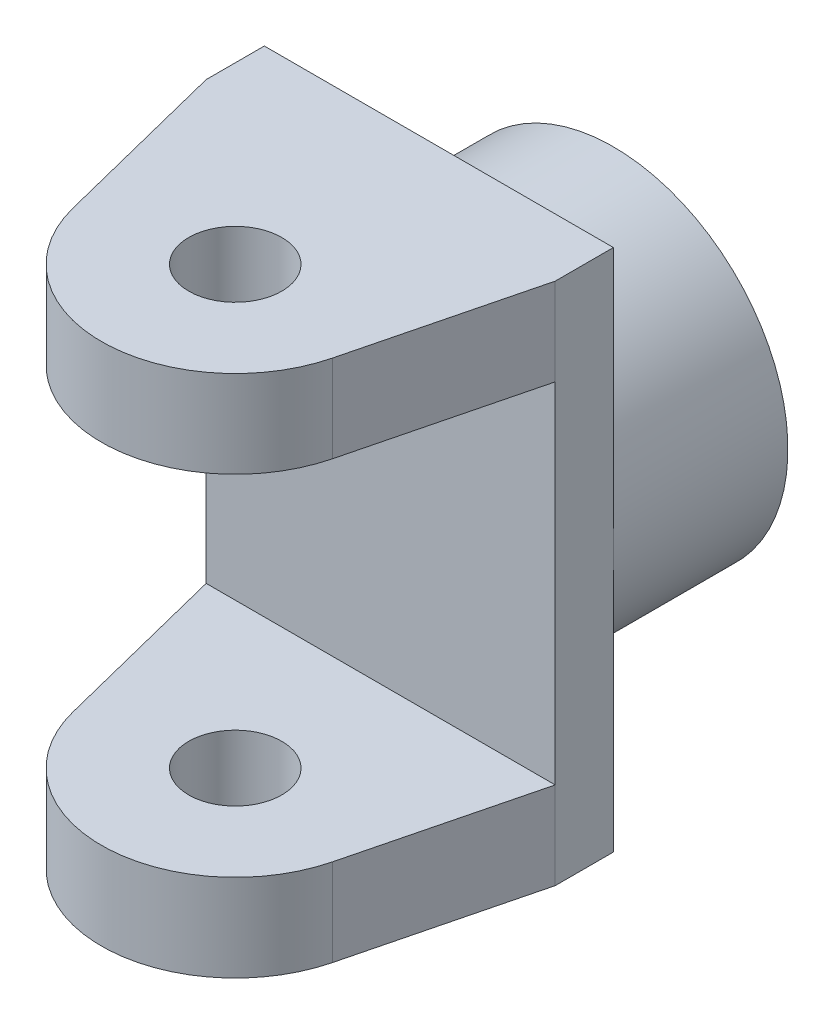
ISO-10303-21;
HEADER;
FILE_DESCRIPTION(('STEP AP214'),'2;1');
FILE_NAME('part.step','',(''),(''),'','','');
FILE_SCHEMA(('AUTOMOTIVE_DESIGN { 1 0 10303 214 1 1 1 1 }'));
ENDSEC;
DATA;
#1=APPLICATION_CONTEXT('core data for automotive mechanical design processes');
#2=APPLICATION_PROTOCOL_DEFINITION('international standard','automotive_design',2000,#1);
#3=PRODUCT_CONTEXT('',#1,'mechanical');
#4=PRODUCT('Part','Part','',(#3));
#5=PRODUCT_RELATED_PRODUCT_CATEGORY('part','',(#4));
#6=PRODUCT_DEFINITION_FORMATION('','',#4);
#7=PRODUCT_DEFINITION_CONTEXT('part definition',#1,'design');
#8=PRODUCT_DEFINITION('design','',#6,#7);
#9=PRODUCT_DEFINITION_SHAPE('','',#8);
#10=(LENGTH_UNIT() NAMED_UNIT(*) SI_UNIT(.MILLI.,.METRE.));
#11=(NAMED_UNIT(*) PLANE_ANGLE_UNIT() SI_UNIT($,.RADIAN.));
#12=(NAMED_UNIT(*) SI_UNIT($,.STERADIAN.) SOLID_ANGLE_UNIT());
#13=UNCERTAINTY_MEASURE_WITH_UNIT(LENGTH_MEASURE(1.E-05),#10,'distance_accuracy_value','');
#14=(GEOMETRIC_REPRESENTATION_CONTEXT(3) GLOBAL_UNCERTAINTY_ASSIGNED_CONTEXT((#13)) GLOBAL_UNIT_ASSIGNED_CONTEXT((#10,
#11,#12)) REPRESENTATION_CONTEXT('',''));
#15=CARTESIAN_POINT('',(0.,0.,0.));
#16=DIRECTION('',(0.,0.,1.));
#17=DIRECTION('',(1.,0.,0.));
#18=AXIS2_PLACEMENT_3D('',#15,#16,#17);
#19=CARTESIAN_POINT('',(0.,0.,10.));
#20=DIRECTION('',(0.,0.,-1.));
#21=DIRECTION('',(-1.,0.,0.));
#22=AXIS2_PLACEMENT_3D('',#19,#20,#21);
#23=PLANE('',#22);
#24=DIRECTION('',(-1.,0.,0.));
#25=VECTOR('',#24,1.);
#26=CARTESIAN_POINT('',(30.,-30.,10.));
#27=LINE('',#26,#25);
#28=CARTESIAN_POINT('',(30.,-30.,10.));
#29=VERTEX_POINT('',#28);
#30=CARTESIAN_POINT('',(-30.,-30.,10.));
#31=VERTEX_POINT('',#30);
#32=EDGE_CURVE('E64',#29,#31,#27,.T.);
#33=ORIENTED_EDGE('',*,*,#32,.F.);
#34=DIRECTION('',(0.,1.,0.));
#35=VECTOR('',#34,1.);
#36=CARTESIAN_POINT('',(30.,-45.,10.));
#37=LINE('',#36,#35);
#38=CARTESIAN_POINT('',(30.,30.,10.));
#39=VERTEX_POINT('',#38);
#40=EDGE_CURVE('E299',#29,#39,#37,.T.);
#41=ORIENTED_EDGE('',*,*,#40,.T.);
#42=DIRECTION('',(-1.,0.,0.));
#43=VECTOR('',#42,1.);
#44=CARTESIAN_POINT('',(30.,30.,10.));
#45=LINE('',#44,#43);
#46=CARTESIAN_POINT('',(-30.,30.,10.));
#47=VERTEX_POINT('',#46);
#48=EDGE_CURVE('E214',#39,#47,#45,.T.);
#49=ORIENTED_EDGE('',*,*,#48,.T.);
#50=DIRECTION('',(0.,-1.,0.));
#51=VECTOR('',#50,1.);
#52=CARTESIAN_POINT('',(-30.,-45.,10.));
#53=LINE('',#52,#51);
#54=EDGE_CURVE('E298',#47,#31,#53,.T.);
#55=ORIENTED_EDGE('',*,*,#54,.T.);
#56=EDGE_LOOP('',(#33,#41,#49,#55));
#57=FACE_BOUND('',#56,.T.);
#58=ADVANCED_FACE('F39',(#57),#23,.F.);
#59=CARTESIAN_POINT('',(0.,0.,0.));
#60=DIRECTION('',(0.,0.,-1.));
#61=DIRECTION('',(-1.,0.,0.));
#62=AXIS2_PLACEMENT_3D('',#59,#60,#61);
#63=PLANE('',#62);
#64=CARTESIAN_POINT('',(0.,0.,0.));
#65=DIRECTION('',(0.,0.,-1.));
#66=DIRECTION('',(-1.,0.,0.));
#67=AXIS2_PLACEMENT_3D('',#64,#65,#66);
#68=CIRCLE('',#67,30.);
#69=CARTESIAN_POINT('',(-30.,0.,0.));
#70=VERTEX_POINT('',#69);
#71=CARTESIAN_POINT('',(30.,0.,0.));
#72=VERTEX_POINT('',#71);
#73=EDGE_CURVE('E50',#70,#72,#68,.T.);
#74=ORIENTED_EDGE('',*,*,#73,.F.);
#75=DIRECTION('',(0.,-1.,0.));
#76=VECTOR('',#75,1.);
#77=CARTESIAN_POINT('',(-30.,-45.,0.));
#78=LINE('',#77,#76);
#79=CARTESIAN_POINT('',(-30.,45.,0.));
#80=VERTEX_POINT('',#79);
#81=EDGE_CURVE('E313',#80,#70,#78,.T.);
#82=ORIENTED_EDGE('',*,*,#81,.F.);
#83=DIRECTION('',(-1.,0.,0.));
#84=VECTOR('',#83,1.);
#85=CARTESIAN_POINT('',(-30.,45.,0.));
#86=LINE('',#85,#84);
#87=CARTESIAN_POINT('',(30.,45.,0.));
#88=VERTEX_POINT('',#87);
#89=EDGE_CURVE('E309',#88,#80,#86,.T.);
#90=ORIENTED_EDGE('',*,*,#89,.F.);
#91=DIRECTION('',(0.,1.,0.));
#92=VECTOR('',#91,1.);
#93=CARTESIAN_POINT('',(30.,-45.,0.));
#94=LINE('',#93,#92);
#95=EDGE_CURVE('E292',#72,#88,#94,.T.);
#96=ORIENTED_EDGE('',*,*,#95,.F.);
#97=EDGE_LOOP('',(#74,#82,#90,#96));
#98=FACE_BOUND('',#97,.T.);
#99=ADVANCED_FACE('F346',(#98),#63,.T.);
#100=CARTESIAN_POINT('',(30.,-45.,10.));
#101=DIRECTION('',(-1.,0.,0.));
#102=DIRECTION('',(0.,0.,1.));
#103=AXIS2_PLACEMENT_3D('',#100,#101,#102);
#104=PLANE('',#103);
#105=CARTESIAN_POINT('',(30.,-45.,0.));
#106=VERTEX_POINT('',#105);
#107=EDGE_CURVE('E305',#106,#72,#94,.T.);
#108=ORIENTED_EDGE('',*,*,#107,.T.);
#109=ORIENTED_EDGE('',*,*,#95,.T.);
#110=DIRECTION('',(0.,0.,-1.));
#111=VECTOR('',#110,1.);
#112=CARTESIAN_POINT('',(30.,45.,10.));
#113=LINE('',#112,#111);
#114=CARTESIAN_POINT('',(30.,45.,10.));
#115=VERTEX_POINT('',#114);
#116=EDGE_CURVE('E43',#115,#88,#113,.T.);
#117=ORIENTED_EDGE('',*,*,#116,.F.);
#118=DIRECTION('',(0.,1.,0.));
#119=VECTOR('',#118,1.);
#120=CARTESIAN_POINT('',(30.,30.,10.));
#121=LINE('',#120,#119);
#122=EDGE_CURVE('E227',#39,#115,#121,.T.);
#123=ORIENTED_EDGE('',*,*,#122,.F.);
#124=ORIENTED_EDGE('',*,*,#40,.F.);
#125=CARTESIAN_POINT('',(30.,-45.,10.));
#126=VERTEX_POINT('',#125);
#127=EDGE_CURVE('E177',#126,#29,#37,.T.);
#128=ORIENTED_EDGE('',*,*,#127,.F.);
#129=DIRECTION('',(0.,0.,-1.));
#130=VECTOR('',#129,1.);
#131=CARTESIAN_POINT('',(30.,-45.,10.));
#132=LINE('',#131,#130);
#133=EDGE_CURVE('E304',#126,#106,#132,.T.);
#134=ORIENTED_EDGE('',*,*,#133,.T.);
#135=EDGE_LOOP('',(#108,#109,#117,#123,#124,#128,#134));
#136=FACE_BOUND('',#135,.T.);
#137=ADVANCED_FACE('F41',(#136),#104,.F.);
#138=CARTESIAN_POINT('',(-30.,45.,10.));
#139=DIRECTION('',(0.,-1.,0.));
#140=DIRECTION('',(0.,0.,-1.));
#141=AXIS2_PLACEMENT_3D('',#138,#139,#140);
#142=PLANE('',#141);
#143=ORIENTED_EDGE('',*,*,#89,.T.);
#144=DIRECTION('',(0.,0.,-1.));
#145=VECTOR('',#144,1.);
#146=CARTESIAN_POINT('',(-30.,45.,10.));
#147=LINE('',#146,#145);
#148=CARTESIAN_POINT('',(-30.,45.,10.));
#149=VERTEX_POINT('',#148);
#150=EDGE_CURVE('E325',#149,#80,#147,.T.);
#151=ORIENTED_EDGE('',*,*,#150,.F.);
#152=DIRECTION('',(0.243792806743351,0.,0.969827338952764));
#153=VECTOR('',#152,1.);
#154=CARTESIAN_POINT('',(-30.,45.,10.));
#155=LINE('',#154,#153);
#156=CARTESIAN_POINT('',(-22.3060287959128,45.,40.6072345550969));
#157=VERTEX_POINT('',#156);
#158=EDGE_CURVE('E231',#149,#157,#155,.T.);
#159=ORIENTED_EDGE('',*,*,#158,.T.);
#160=CARTESIAN_POINT('',(0.,45.,35.));
#161=DIRECTION('',(0.,1.,0.));
#162=DIRECTION('',(0.,0.,1.));
#163=AXIS2_PLACEMENT_3D('',#160,#161,#162);
#164=CIRCLE('',#163,22.9999999999992);
#165=CARTESIAN_POINT('',(22.3060287959128,45.,40.6072345550969));
#166=VERTEX_POINT('',#165);
#167=EDGE_CURVE('E215',#157,#166,#164,.T.);
#168=ORIENTED_EDGE('',*,*,#167,.T.);
#169=DIRECTION('',(0.24379280674335,0.,-0.969827338952764));
#170=VECTOR('',#169,1.);
#171=CARTESIAN_POINT('',(30.,45.,10.));
#172=LINE('',#171,#170);
#173=EDGE_CURVE('E206',#166,#115,#172,.T.);
#174=ORIENTED_EDGE('',*,*,#173,.T.);
#175=ORIENTED_EDGE('',*,*,#116,.T.);
#176=EDGE_LOOP('',(#143,#151,#159,#168,#174,#175));
#177=FACE_BOUND('',#176,.T.);
#178=CARTESIAN_POINT('',(0.,45.,35.));
#179=DIRECTION('',(0.,1.,0.));
#180=DIRECTION('',(0.,0.,1.));
#181=AXIS2_PLACEMENT_3D('',#178,#179,#180);
#182=CIRCLE('',#181,8.);
#183=CARTESIAN_POINT('',(0.,45.,43.));
#184=VERTEX_POINT('',#183);
#185=EDGE_CURVE('E199',#184,#184,#182,.T.);
#186=ORIENTED_EDGE('',*,*,#185,.F.);
#187=EDGE_LOOP('',(#186));
#188=FACE_BOUND('',#187,.T.);
#189=ADVANCED_FACE('F335',(#177,#188),#142,.F.);
#190=CARTESIAN_POINT('',(-30.,-45.,10.));
#191=DIRECTION('',(1.,0.,0.));
#192=DIRECTION('',(0.,0.,-1.));
#193=AXIS2_PLACEMENT_3D('',#190,#191,#192);
#194=PLANE('',#193);
#195=ORIENTED_EDGE('',*,*,#81,.T.);
#196=CARTESIAN_POINT('',(-30.,-45.,0.));
#197=VERTEX_POINT('',#196);
#198=EDGE_CURVE('E312',#70,#197,#78,.T.);
#199=ORIENTED_EDGE('',*,*,#198,.T.);
#200=DIRECTION('',(0.,0.,-1.));
#201=VECTOR('',#200,1.);
#202=CARTESIAN_POINT('',(-30.,-45.,10.));
#203=LINE('',#202,#201);
#204=CARTESIAN_POINT('',(-30.,-45.,10.));
#205=VERTEX_POINT('',#204);
#206=EDGE_CURVE('E322',#205,#197,#203,.T.);
#207=ORIENTED_EDGE('',*,*,#206,.F.);
#208=DIRECTION('',(0.,-1.,0.));
#209=VECTOR('',#208,1.);
#210=CARTESIAN_POINT('',(-30.,-30.,10.));
#211=LINE('',#210,#209);
#212=EDGE_CURVE('E57',#31,#205,#211,.T.);
#213=ORIENTED_EDGE('',*,*,#212,.F.);
#214=ORIENTED_EDGE('',*,*,#54,.F.);
#215=EDGE_CURVE('E300',#149,#47,#53,.T.);
#216=ORIENTED_EDGE('',*,*,#215,.F.);
#217=ORIENTED_EDGE('',*,*,#150,.T.);
#218=EDGE_LOOP('',(#195,#199,#207,#213,#214,#216,#217));
#219=FACE_BOUND('',#218,.T.);
#220=ADVANCED_FACE('F348',(#219),#194,.F.);
#221=CARTESIAN_POINT('',(-30.,-45.,10.));
#222=DIRECTION('',(0.,1.,0.));
#223=DIRECTION('',(0.,0.,1.));
#224=AXIS2_PLACEMENT_3D('',#221,#222,#223);
#225=PLANE('',#224);
#226=DIRECTION('',(1.,0.,0.));
#227=VECTOR('',#226,1.);
#228=CARTESIAN_POINT('',(-30.,-45.,0.));
#229=LINE('',#228,#227);
#230=EDGE_CURVE('E316',#197,#106,#229,.T.);
#231=ORIENTED_EDGE('',*,*,#230,.T.);
#232=ORIENTED_EDGE('',*,*,#133,.F.);
#233=DIRECTION('',(0.24379280674335,0.,-0.969827338952764));
#234=VECTOR('',#233,1.);
#235=CARTESIAN_POINT('',(30.,-45.,10.));
#236=LINE('',#235,#234);
#237=CARTESIAN_POINT('',(22.3060287959128,-45.,40.6072345550969));
#238=VERTEX_POINT('',#237);
#239=EDGE_CURVE('E191',#238,#126,#236,.T.);
#240=ORIENTED_EDGE('',*,*,#239,.F.);
#241=CARTESIAN_POINT('',(0.,-45.,35.));
#242=DIRECTION('',(0.,1.,0.));
#243=DIRECTION('',(0.,0.,1.));
#244=AXIS2_PLACEMENT_3D('',#241,#242,#243);
#245=CIRCLE('',#244,22.9999999999992);
#246=CARTESIAN_POINT('',(-22.3060287959128,-45.,40.6072345550969));
#247=VERTEX_POINT('',#246);
#248=EDGE_CURVE('E168',#247,#238,#245,.T.);
#249=ORIENTED_EDGE('',*,*,#248,.F.);
#250=DIRECTION('',(0.243792806743351,0.,0.969827338952764));
#251=VECTOR('',#250,1.);
#252=CARTESIAN_POINT('',(-30.,-45.,10.));
#253=LINE('',#252,#251);
#254=EDGE_CURVE('E179',#205,#247,#253,.T.);
#255=ORIENTED_EDGE('',*,*,#254,.F.);
#256=ORIENTED_EDGE('',*,*,#206,.T.);
#257=EDGE_LOOP('',(#231,#232,#240,#249,#255,#256));
#258=FACE_BOUND('',#257,.T.);
#259=CARTESIAN_POINT('',(0.,-45.,35.));
#260=DIRECTION('',(0.,1.,0.));
#261=DIRECTION('',(0.,0.,1.));
#262=AXIS2_PLACEMENT_3D('',#259,#260,#261);
#263=CIRCLE('',#262,8.);
#264=CARTESIAN_POINT('',(0.,-45.,43.));
#265=VERTEX_POINT('',#264);
#266=EDGE_CURVE('E184',#265,#265,#263,.T.);
#267=ORIENTED_EDGE('',*,*,#266,.T.);
#268=EDGE_LOOP('',(#267));
#269=FACE_BOUND('',#268,.T.);
#270=ADVANCED_FACE('F360',(#258,#269),#225,.F.);
#271=EDGE_CURVE('E11',#72,#70,#68,.T.);
#272=ORIENTED_EDGE('',*,*,#271,.F.);
#273=ORIENTED_EDGE('',*,*,#107,.F.);
#274=ORIENTED_EDGE('',*,*,#230,.F.);
#275=ORIENTED_EDGE('',*,*,#198,.F.);
#276=EDGE_LOOP('',(#272,#273,#274,#275));
#277=FACE_BOUND('',#276,.T.);
#278=ADVANCED_FACE('F351',(#277),#63,.T.);
#279=CARTESIAN_POINT('',(0.,0.,-30.));
#280=DIRECTION('',(0.,0.,-1.));
#281=DIRECTION('',(-1.,0.,0.));
#282=AXIS2_PLACEMENT_3D('',#279,#280,#281);
#283=PLANE('',#282);
#284=CARTESIAN_POINT('',(0.,0.,-30.));
#285=DIRECTION('',(0.,0.,-1.));
#286=DIRECTION('',(-1.,0.,0.));
#287=AXIS2_PLACEMENT_3D('',#284,#285,#286);
#288=CIRCLE('',#287,30.);
#289=CARTESIAN_POINT('',(-30.,0.,-30.));
#290=VERTEX_POINT('',#289);
#291=EDGE_CURVE('E289',#290,#290,#288,.T.);
#292=ORIENTED_EDGE('',*,*,#291,.T.);
#293=EDGE_LOOP('',(#292));
#294=FACE_BOUND('',#293,.T.);
#295=DIRECTION('',(0.,1.,0.));
#296=VECTOR('',#295,1.);
#297=CARTESIAN_POINT('',(-4.,-13.9126853865912,-30.));
#298=LINE('',#297,#296);
#299=CARTESIAN_POINT('',(-4.,-16.9126853865912,-30.));
#300=VERTEX_POINT('',#299);
#301=CARTESIAN_POINT('',(-4.,-13.3252697783673,-30.));
#302=VERTEX_POINT('',#301);
#303=EDGE_CURVE('E254',#300,#302,#298,.T.);
#304=ORIENTED_EDGE('',*,*,#303,.F.);
#305=DIRECTION('',(-1.,0.,0.));
#306=VECTOR('',#305,1.);
#307=CARTESIAN_POINT('',(4.,-16.9126853865912,-30.));
#308=LINE('',#307,#306);
#309=CARTESIAN_POINT('',(4.,-16.9126853865912,-30.));
#310=VERTEX_POINT('',#309);
#311=EDGE_CURVE('E250',#310,#300,#308,.T.);
#312=ORIENTED_EDGE('',*,*,#311,.F.);
#313=DIRECTION('',(0.,-1.,0.));
#314=VECTOR('',#313,1.);
#315=CARTESIAN_POINT('',(4.,-13.9126853865912,-30.));
#316=LINE('',#315,#314);
#317=CARTESIAN_POINT('',(4.,-13.3252697783673,-30.));
#318=VERTEX_POINT('',#317);
#319=EDGE_CURVE('E247',#318,#310,#316,.T.);
#320=ORIENTED_EDGE('',*,*,#319,.F.);
#321=CARTESIAN_POINT('',(0.,0.,-30.));
#322=DIRECTION('',(0.,0.,-1.));
#323=DIRECTION('',(-1.,0.,0.));
#324=AXIS2_PLACEMENT_3D('',#321,#322,#323);
#325=CIRCLE('',#324,13.9126853865912);
#326=EDGE_CURVE('E257',#302,#318,#325,.T.);
#327=ORIENTED_EDGE('',*,*,#326,.F.);
#328=EDGE_LOOP('',(#304,#312,#320,#327));
#329=FACE_BOUND('',#328,.T.);
#330=ADVANCED_FACE('F398',(#294,#329),#283,.T.);
#331=CARTESIAN_POINT('',(0.,0.,-30.));
#332=DIRECTION('',(0.,0.,1.));
#333=DIRECTION('',(1.,0.,0.));
#334=AXIS2_PLACEMENT_3D('',#331,#332,#333);
#335=CYLINDRICAL_SURFACE('',#334,30.);
#336=ORIENTED_EDGE('',*,*,#291,.F.);
#337=EDGE_LOOP('',(#336));
#338=FACE_BOUND('',#337,.T.);
#339=ORIENTED_EDGE('',*,*,#73,.T.);
#340=ORIENTED_EDGE('',*,*,#271,.T.);
#341=EDGE_LOOP('',(#339,#340));
#342=FACE_BOUND('',#341,.T.);
#343=ADVANCED_FACE('F394',(#338,#342),#335,.T.);
#344=CARTESIAN_POINT('',(4.,-16.9126853865912,-30.));
#345=DIRECTION('',(0.,1.,0.));
#346=DIRECTION('',(0.,0.,1.));
#347=AXIS2_PLACEMENT_3D('',#344,#345,#346);
#348=PLANE('',#347);
#349=DIRECTION('',(-1.,0.,0.));
#350=VECTOR('',#349,1.);
#351=CARTESIAN_POINT('',(4.,-16.9126853865912,0.));
#352=LINE('',#351,#350);
#353=CARTESIAN_POINT('',(4.,-16.9126853865912,0.));
#354=VERTEX_POINT('',#353);
#355=CARTESIAN_POINT('',(-4.,-16.9126853865912,0.));
#356=VERTEX_POINT('',#355);
#357=EDGE_CURVE('E241',#354,#356,#352,.T.);
#358=ORIENTED_EDGE('',*,*,#357,.F.);
#359=DIRECTION('',(0.,0.,1.));
#360=VECTOR('',#359,1.);
#361=CARTESIAN_POINT('',(4.,-16.9126853865912,-30.));
#362=LINE('',#361,#360);
#363=EDGE_CURVE('E285',#310,#354,#362,.T.);
#364=ORIENTED_EDGE('',*,*,#363,.F.);
#365=ORIENTED_EDGE('',*,*,#311,.T.);
#366=DIRECTION('',(0.,0.,1.));
#367=VECTOR('',#366,1.);
#368=CARTESIAN_POINT('',(-4.,-16.9126853865912,-30.));
#369=LINE('',#368,#367);
#370=EDGE_CURVE('E281',#300,#356,#369,.T.);
#371=ORIENTED_EDGE('',*,*,#370,.T.);
#372=EDGE_LOOP('',(#358,#364,#365,#371));
#373=FACE_BOUND('',#372,.T.);
#374=ADVANCED_FACE('F539',(#373),#348,.T.);
#375=CARTESIAN_POINT('',(-4.,-13.9126853865912,-30.));
#376=DIRECTION('',(1.,0.,0.));
#377=DIRECTION('',(0.,0.,-1.));
#378=AXIS2_PLACEMENT_3D('',#375,#376,#377);
#379=PLANE('',#378);
#380=DIRECTION('',(0.,1.,0.));
#381=VECTOR('',#380,1.);
#382=CARTESIAN_POINT('',(-4.,-13.9126853865912,0.));
#383=LINE('',#382,#381);
#384=CARTESIAN_POINT('',(-4.,-13.3252697783673,0.));
#385=VERTEX_POINT('',#384);
#386=EDGE_CURVE('E265',#356,#385,#383,.T.);
#387=ORIENTED_EDGE('',*,*,#386,.F.);
#388=ORIENTED_EDGE('',*,*,#370,.F.);
#389=ORIENTED_EDGE('',*,*,#303,.T.);
#390=DIRECTION('',(0.,0.,1.));
#391=VECTOR('',#390,1.);
#392=CARTESIAN_POINT('',(-4.,-13.3252697783673,-30.));
#393=LINE('',#392,#391);
#394=EDGE_CURVE('E278',#302,#385,#393,.T.);
#395=ORIENTED_EDGE('',*,*,#394,.T.);
#396=EDGE_LOOP('',(#387,#388,#389,#395));
#397=FACE_BOUND('',#396,.T.);
#398=ADVANCED_FACE('F529',(#397),#379,.T.);
#399=CARTESIAN_POINT('',(0.,0.,-30.));
#400=DIRECTION('',(0.,0.,1.));
#401=DIRECTION('',(1.,0.,0.));
#402=AXIS2_PLACEMENT_3D('',#399,#400,#401);
#403=CYLINDRICAL_SURFACE('',#402,13.9126853865912);
#404=CARTESIAN_POINT('',(0.,0.,0.));
#405=DIRECTION('',(0.,0.,-1.));
#406=DIRECTION('',(-1.,0.,0.));
#407=AXIS2_PLACEMENT_3D('',#404,#405,#406);
#408=CIRCLE('',#407,13.9126853865912);
#409=CARTESIAN_POINT('',(4.,-13.3252697783673,0.));
#410=VERTEX_POINT('',#409);
#411=EDGE_CURVE('E269',#385,#410,#408,.T.);
#412=ORIENTED_EDGE('',*,*,#411,.F.);
#413=ORIENTED_EDGE('',*,*,#394,.F.);
#414=ORIENTED_EDGE('',*,*,#326,.T.);
#415=DIRECTION('',(0.,0.,1.));
#416=VECTOR('',#415,1.);
#417=CARTESIAN_POINT('',(4.,-13.3252697783673,-30.));
#418=LINE('',#417,#416);
#419=EDGE_CURVE('E261',#318,#410,#418,.T.);
#420=ORIENTED_EDGE('',*,*,#419,.T.);
#421=EDGE_LOOP('',(#412,#413,#414,#420));
#422=FACE_BOUND('',#421,.T.);
#423=ADVANCED_FACE('F518',(#422),#403,.F.);
#424=CARTESIAN_POINT('',(4.,-13.9126853865912,-30.));
#425=DIRECTION('',(-1.,0.,0.));
#426=DIRECTION('',(0.,0.,1.));
#427=AXIS2_PLACEMENT_3D('',#424,#425,#426);
#428=PLANE('',#427);
#429=DIRECTION('',(0.,-1.,0.));
#430=VECTOR('',#429,1.);
#431=CARTESIAN_POINT('',(4.,-13.9126853865912,0.));
#432=LINE('',#431,#430);
#433=EDGE_CURVE('E251',#410,#354,#432,.T.);
#434=ORIENTED_EDGE('',*,*,#433,.F.);
#435=ORIENTED_EDGE('',*,*,#419,.F.);
#436=ORIENTED_EDGE('',*,*,#319,.T.);
#437=ORIENTED_EDGE('',*,*,#363,.T.);
#438=EDGE_LOOP('',(#434,#435,#436,#437));
#439=FACE_BOUND('',#438,.T.);
#440=ADVANCED_FACE('F508',(#439),#428,.T.);
#441=ORIENTED_EDGE('',*,*,#433,.T.);
#442=ORIENTED_EDGE('',*,*,#357,.T.);
#443=ORIENTED_EDGE('',*,*,#386,.T.);
#444=ORIENTED_EDGE('',*,*,#411,.T.);
#445=EDGE_LOOP('',(#441,#442,#443,#444));
#446=FACE_BOUND('',#445,.T.);
#447=ADVANCED_FACE('F392',(#446),#63,.T.);
#448=CARTESIAN_POINT('',(30.,30.,10.));
#449=DIRECTION('',(0.969827338952764,0.,0.24379280674335));
#450=DIRECTION('',(0.24379280674335,0.,-0.969827338952764));
#451=AXIS2_PLACEMENT_3D('',#448,#449,#450);
#452=PLANE('',#451);
#453=ORIENTED_EDGE('',*,*,#173,.F.);
#454=DIRECTION('',(0.,1.,0.));
#455=VECTOR('',#454,1.);
#456=CARTESIAN_POINT('',(22.3060287959128,30.,40.6072345550969));
#457=LINE('',#456,#455);
#458=CARTESIAN_POINT('',(22.3060287959128,30.,40.6072345550969));
#459=VERTEX_POINT('',#458);
#460=EDGE_CURVE('E238',#459,#166,#457,.T.);
#461=ORIENTED_EDGE('',*,*,#460,.F.);
#462=DIRECTION('',(0.24379280674335,0.,-0.969827338952764));
#463=VECTOR('',#462,1.);
#464=CARTESIAN_POINT('',(30.,30.,10.));
#465=LINE('',#464,#463);
#466=EDGE_CURVE('E210',#459,#39,#465,.T.);
#467=ORIENTED_EDGE('',*,*,#466,.T.);
#468=ORIENTED_EDGE('',*,*,#122,.T.);
#469=EDGE_LOOP('',(#453,#461,#467,#468));
#470=FACE_BOUND('',#469,.T.);
#471=ADVANCED_FACE('F367',(#470),#452,.T.);
#472=CARTESIAN_POINT('',(0.,30.,35.));
#473=DIRECTION('',(0.,1.,0.));
#474=DIRECTION('',(0.,0.,1.));
#475=AXIS2_PLACEMENT_3D('',#472,#473,#474);
#476=CYLINDRICAL_SURFACE('',#475,22.9999999999992);
#477=ORIENTED_EDGE('',*,*,#167,.F.);
#478=DIRECTION('',(0.,1.,0.));
#479=VECTOR('',#478,1.);
#480=CARTESIAN_POINT('',(-22.3060287959128,30.,40.6072345550969));
#481=LINE('',#480,#479);
#482=CARTESIAN_POINT('',(-22.3060287959128,30.,40.6072345550969));
#483=VERTEX_POINT('',#482);
#484=EDGE_CURVE('E242',#483,#157,#481,.T.);
#485=ORIENTED_EDGE('',*,*,#484,.F.);
#486=CARTESIAN_POINT('',(0.,30.,35.));
#487=DIRECTION('',(0.,1.,0.));
#488=DIRECTION('',(0.,0.,1.));
#489=AXIS2_PLACEMENT_3D('',#486,#487,#488);
#490=CIRCLE('',#489,22.9999999999992);
#491=EDGE_CURVE('E223',#483,#459,#490,.T.);
#492=ORIENTED_EDGE('',*,*,#491,.T.);
#493=ORIENTED_EDGE('',*,*,#460,.T.);
#494=EDGE_LOOP('',(#477,#485,#492,#493));
#495=FACE_BOUND('',#494,.T.);
#496=ADVANCED_FACE('F370',(#495),#476,.T.);
#497=CARTESIAN_POINT('',(-30.,30.,10.));
#498=DIRECTION('',(-0.969827338952764,0.,0.243792806743351));
#499=DIRECTION('',(0.243792806743351,0.,0.969827338952764));
#500=AXIS2_PLACEMENT_3D('',#497,#498,#499);
#501=PLANE('',#500);
#502=ORIENTED_EDGE('',*,*,#158,.F.);
#503=ORIENTED_EDGE('',*,*,#215,.T.);
#504=DIRECTION('',(0.243792806743351,0.,0.969827338952764));
#505=VECTOR('',#504,1.);
#506=CARTESIAN_POINT('',(-30.,30.,10.));
#507=LINE('',#506,#505);
#508=EDGE_CURVE('E219',#47,#483,#507,.T.);
#509=ORIENTED_EDGE('',*,*,#508,.T.);
#510=ORIENTED_EDGE('',*,*,#484,.T.);
#511=EDGE_LOOP('',(#502,#503,#509,#510));
#512=FACE_BOUND('',#511,.T.);
#513=ADVANCED_FACE('F372',(#512),#501,.T.);
#514=CARTESIAN_POINT('',(0.,30.,35.));
#515=DIRECTION('',(0.,1.,0.));
#516=DIRECTION('',(0.,0.,1.));
#517=AXIS2_PLACEMENT_3D('',#514,#515,#516);
#518=PLANE('',#517);
#519=CARTESIAN_POINT('',(0.,30.,35.));
#520=DIRECTION('',(0.,1.,0.));
#521=DIRECTION('',(0.,0.,1.));
#522=AXIS2_PLACEMENT_3D('',#519,#520,#521);
#523=CIRCLE('',#522,8.);
#524=CARTESIAN_POINT('',(0.,30.,43.));
#525=VERTEX_POINT('',#524);
#526=EDGE_CURVE('E202',#525,#525,#523,.T.);
#527=ORIENTED_EDGE('',*,*,#526,.T.);
#528=EDGE_LOOP('',(#527));
#529=FACE_BOUND('',#528,.T.);
#530=ORIENTED_EDGE('',*,*,#466,.F.);
#531=ORIENTED_EDGE('',*,*,#491,.F.);
#532=ORIENTED_EDGE('',*,*,#508,.F.);
#533=ORIENTED_EDGE('',*,*,#48,.F.);
#534=EDGE_LOOP('',(#530,#531,#532,#533));
#535=FACE_BOUND('',#534,.T.);
#536=ADVANCED_FACE('F364',(#529,#535),#518,.F.);
#537=CARTESIAN_POINT('',(0.,30.,35.));
#538=DIRECTION('',(0.,1.,0.));
#539=DIRECTION('',(0.,0.,1.));
#540=AXIS2_PLACEMENT_3D('',#537,#538,#539);
#541=CYLINDRICAL_SURFACE('',#540,8.);
#542=ORIENTED_EDGE('',*,*,#526,.F.);
#543=EDGE_LOOP('',(#542));
#544=FACE_BOUND('',#543,.T.);
#545=ORIENTED_EDGE('',*,*,#185,.T.);
#546=EDGE_LOOP('',(#545));
#547=FACE_BOUND('',#546,.T.);
#548=ADVANCED_FACE('F379',(#544,#547),#541,.F.);
#549=CARTESIAN_POINT('',(0.,-30.,35.));
#550=DIRECTION('',(0.,-1.,0.));
#551=DIRECTION('',(0.,0.,1.));
#552=AXIS2_PLACEMENT_3D('',#549,#550,#551);
#553=PLANE('',#552);
#554=DIRECTION('',(0.24379280674335,0.,-0.969827338952764));
#555=VECTOR('',#554,1.);
#556=CARTESIAN_POINT('',(30.,-30.,10.));
#557=LINE('',#556,#555);
#558=CARTESIAN_POINT('',(22.3060287959128,-30.,40.6072345550969));
#559=VERTEX_POINT('',#558);
#560=EDGE_CURVE('E155',#559,#29,#557,.T.);
#561=ORIENTED_EDGE('',*,*,#560,.T.);
#562=ORIENTED_EDGE('',*,*,#32,.T.);
#563=DIRECTION('',(0.243792806743351,0.,0.969827338952764));
#564=VECTOR('',#563,1.);
#565=CARTESIAN_POINT('',(-30.,-30.,10.));
#566=LINE('',#565,#564);
#567=CARTESIAN_POINT('',(-22.3060287959128,-30.,40.6072345550969));
#568=VERTEX_POINT('',#567);
#569=EDGE_CURVE('E158',#31,#568,#566,.T.);
#570=ORIENTED_EDGE('',*,*,#569,.T.);
#571=CARTESIAN_POINT('',(0.,-30.,35.));
#572=DIRECTION('',(0.,1.,0.));
#573=DIRECTION('',(0.,0.,1.));
#574=AXIS2_PLACEMENT_3D('',#571,#572,#573);
#575=CIRCLE('',#574,22.9999999999992);
#576=EDGE_CURVE('E150',#568,#559,#575,.T.);
#577=ORIENTED_EDGE('',*,*,#576,.T.);
#578=EDGE_LOOP('',(#561,#562,#570,#577));
#579=FACE_BOUND('',#578,.T.);
#580=CARTESIAN_POINT('',(0.,-30.,35.));
#581=DIRECTION('',(0.,1.,0.));
#582=DIRECTION('',(0.,0.,1.));
#583=AXIS2_PLACEMENT_3D('',#580,#581,#582);
#584=CIRCLE('',#583,8.);
#585=CARTESIAN_POINT('',(0.,-30.,43.));
#586=VERTEX_POINT('',#585);
#587=EDGE_CURVE('E194',#586,#586,#584,.T.);
#588=ORIENTED_EDGE('',*,*,#587,.F.);
#589=EDGE_LOOP('',(#588));
#590=FACE_BOUND('',#589,.T.);
#591=ADVANCED_FACE('F152',(#579,#590),#553,.F.);
#592=CARTESIAN_POINT('',(30.,-30.,10.));
#593=DIRECTION('',(-0.969827338952764,0.,-0.24379280674335));
#594=DIRECTION('',(-0.24379280674335,0.,0.969827338952764));
#595=AXIS2_PLACEMENT_3D('',#592,#593,#594);
#596=PLANE('',#595);
#597=ORIENTED_EDGE('',*,*,#239,.T.);
#598=ORIENTED_EDGE('',*,*,#127,.T.);
#599=ORIENTED_EDGE('',*,*,#560,.F.);
#600=DIRECTION('',(0.,-1.,0.));
#601=VECTOR('',#600,1.);
#602=CARTESIAN_POINT('',(22.3060287959128,-30.,40.6072345550969));
#603=LINE('',#602,#601);
#604=EDGE_CURVE('E165',#559,#238,#603,.T.);
#605=ORIENTED_EDGE('',*,*,#604,.T.);
#606=EDGE_LOOP('',(#597,#598,#599,#605));
#607=FACE_BOUND('',#606,.T.);
#608=ADVANCED_FACE('F175',(#607),#596,.F.);
#609=CARTESIAN_POINT('',(-30.,-30.,10.));
#610=DIRECTION('',(0.969827338952764,0.,-0.243792806743351));
#611=DIRECTION('',(-0.243792806743351,0.,-0.969827338952764));
#612=AXIS2_PLACEMENT_3D('',#609,#610,#611);
#613=PLANE('',#612);
#614=ORIENTED_EDGE('',*,*,#254,.T.);
#615=DIRECTION('',(0.,-1.,0.));
#616=VECTOR('',#615,1.);
#617=CARTESIAN_POINT('',(-22.3060287959128,-30.,40.6072345550969));
#618=LINE('',#617,#616);
#619=EDGE_CURVE('E173',#568,#247,#618,.T.);
#620=ORIENTED_EDGE('',*,*,#619,.F.);
#621=ORIENTED_EDGE('',*,*,#569,.F.);
#622=ORIENTED_EDGE('',*,*,#212,.T.);
#623=EDGE_LOOP('',(#614,#620,#621,#622));
#624=FACE_BOUND('',#623,.T.);
#625=ADVANCED_FACE('F357',(#624),#613,.F.);
#626=CARTESIAN_POINT('',(0.,-30.,35.));
#627=DIRECTION('',(0.,-1.,0.));
#628=DIRECTION('',(0.,0.,-1.));
#629=AXIS2_PLACEMENT_3D('',#626,#627,#628);
#630=CYLINDRICAL_SURFACE('',#629,22.9999999999992);
#631=ORIENTED_EDGE('',*,*,#248,.T.);
#632=ORIENTED_EDGE('',*,*,#604,.F.);
#633=ORIENTED_EDGE('',*,*,#576,.F.);
#634=ORIENTED_EDGE('',*,*,#619,.T.);
#635=EDGE_LOOP('',(#631,#632,#633,#634));
#636=FACE_BOUND('',#635,.T.);
#637=ADVANCED_FACE('F166',(#636),#630,.T.);
#638=CARTESIAN_POINT('',(0.,-30.,35.));
#639=DIRECTION('',(0.,-1.,0.));
#640=DIRECTION('',(0.,0.,-1.));
#641=AXIS2_PLACEMENT_3D('',#638,#639,#640);
#642=CYLINDRICAL_SURFACE('',#641,8.);
#643=ORIENTED_EDGE('',*,*,#587,.T.);
#644=EDGE_LOOP('',(#643));
#645=FACE_BOUND('',#644,.T.);
#646=ORIENTED_EDGE('',*,*,#266,.F.);
#647=EDGE_LOOP('',(#646));
#648=FACE_BOUND('',#647,.T.);
#649=ADVANCED_FACE('F452',(#645,#648),#642,.F.);
#650=CLOSED_SHELL('',(#58,#99,#137,#189,#220,#270,#278,#330,#343,#374,#398,#423,#440,#447,#471,
#496,#513,#536,#548,#591,#608,#625,#637,#649));
#651=MANIFOLD_SOLID_BREP('B2',#650);
#652=ADVANCED_BREP_SHAPE_REPRESENTATION('',(#18,#651),#14);
#653=SHAPE_DEFINITION_REPRESENTATION(#9,#652);
ENDSEC;
END-ISO-10303-21;
